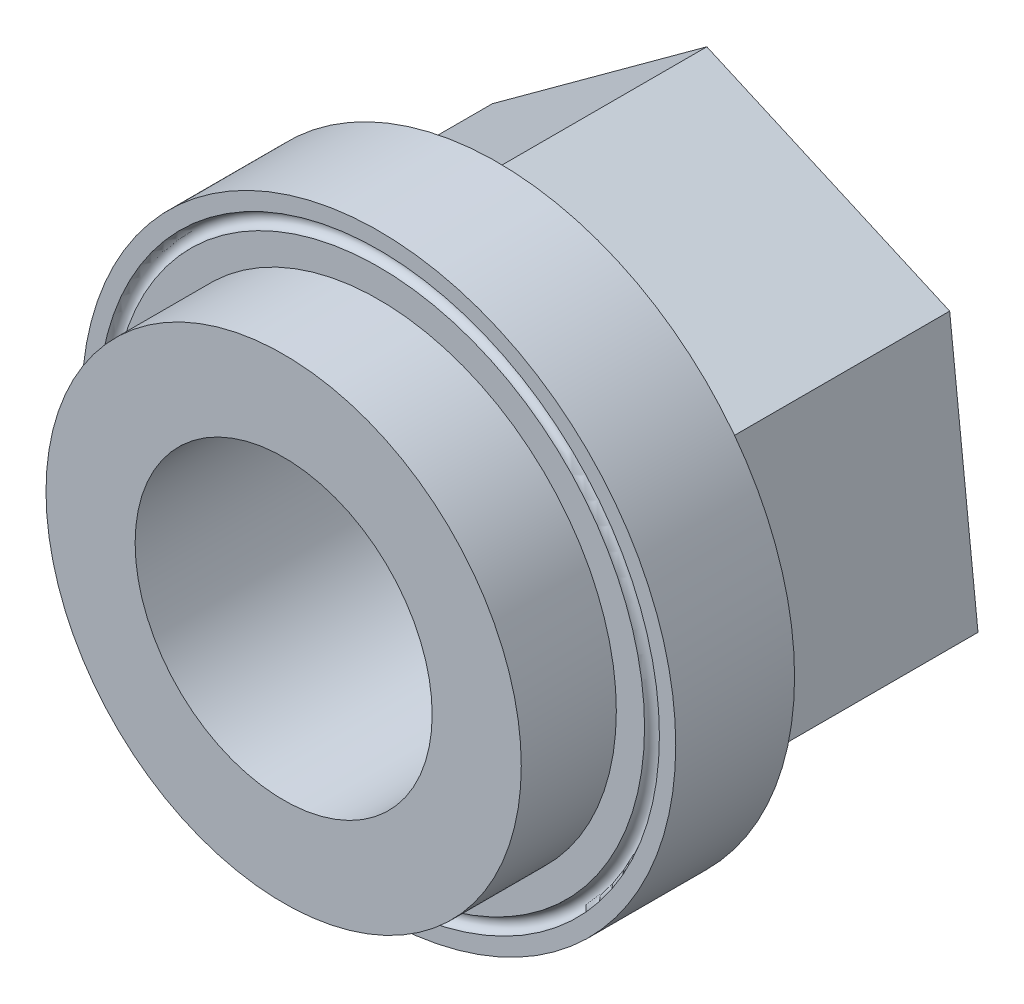
ISO-10303-21;
HEADER;
FILE_DESCRIPTION(('STEP AP214'),'2;1');
FILE_NAME('part.step','',(''),(''),'','','');
FILE_SCHEMA(('AUTOMOTIVE_DESIGN { 1 0 10303 214 1 1 1 1 }'));
ENDSEC;
DATA;
#1=APPLICATION_CONTEXT('core data for automotive mechanical design processes');
#2=APPLICATION_PROTOCOL_DEFINITION('international standard','automotive_design',2000,#1);
#3=PRODUCT_CONTEXT('',#1,'mechanical');
#4=PRODUCT('Part','Part','',(#3));
#5=PRODUCT_RELATED_PRODUCT_CATEGORY('part','',(#4));
#6=PRODUCT_DEFINITION_FORMATION('','',#4);
#7=PRODUCT_DEFINITION_CONTEXT('part definition',#1,'design');
#8=PRODUCT_DEFINITION('design','',#6,#7);
#9=PRODUCT_DEFINITION_SHAPE('','',#8);
#10=(LENGTH_UNIT() NAMED_UNIT(*) SI_UNIT(.MILLI.,.METRE.));
#11=(NAMED_UNIT(*) PLANE_ANGLE_UNIT() SI_UNIT($,.RADIAN.));
#12=(NAMED_UNIT(*) SI_UNIT($,.STERADIAN.) SOLID_ANGLE_UNIT());
#13=UNCERTAINTY_MEASURE_WITH_UNIT(LENGTH_MEASURE(1.E-05),#10,'distance_accuracy_value','');
#14=(GEOMETRIC_REPRESENTATION_CONTEXT(3) GLOBAL_UNCERTAINTY_ASSIGNED_CONTEXT((#13)) GLOBAL_UNIT_ASSIGNED_CONTEXT((#10,
#11,#12)) REPRESENTATION_CONTEXT('',''));
#15=CARTESIAN_POINT('',(0.,0.,0.));
#16=DIRECTION('',(0.,0.,1.));
#17=DIRECTION('',(1.,0.,0.));
#18=AXIS2_PLACEMENT_3D('',#15,#16,#17);
#19=CARTESIAN_POINT('',(0.,0.,10.));
#20=DIRECTION('',(0.,0.,1.));
#21=DIRECTION('',(1.,0.,0.));
#22=AXIS2_PLACEMENT_3D('',#19,#20,#21);
#23=PLANE('',#22);
#24=CARTESIAN_POINT('',(0.,0.,10.));
#25=DIRECTION('',(0.,0.,1.));
#26=DIRECTION('',(1.,0.,0.));
#27=AXIS2_PLACEMENT_3D('',#24,#25,#26);
#28=CIRCLE('',#27,25.);
#29=CARTESIAN_POINT('',(25.,0.,10.));
#30=VERTEX_POINT('',#29);
#31=EDGE_CURVE('E146',#30,#30,#28,.T.);
#32=ORIENTED_EDGE('',*,*,#31,.T.);
#33=EDGE_LOOP('',(#32));
#34=FACE_BOUND('',#33,.T.);
#35=CARTESIAN_POINT('',(0.,0.,10.));
#36=DIRECTION('',(0.,0.,1.));
#37=DIRECTION('',(1.,0.,0.));
#38=AXIS2_PLACEMENT_3D('',#35,#36,#37);
#39=CIRCLE('',#38,23.625);
#40=CARTESIAN_POINT('',(23.625,0.,10.));
#41=VERTEX_POINT('',#40);
#42=EDGE_CURVE('E12',#41,#41,#39,.T.);
#43=ORIENTED_EDGE('',*,*,#42,.F.);
#44=EDGE_LOOP('',(#43));
#45=FACE_BOUND('',#44,.T.);
#46=ADVANCED_FACE('F55',(#34,#45),#23,.T.);
#47=CARTESIAN_POINT('',(0.,0.,10.));
#48=DIRECTION('',(0.,0.,1.));
#49=DIRECTION('',(1.,0.,0.));
#50=AXIS2_PLACEMENT_3D('',#47,#48,#49);
#51=CIRCLE('',#50,20.);
#52=CARTESIAN_POINT('',(20.,0.,10.));
#53=VERTEX_POINT('',#52);
#54=EDGE_CURVE('E143',#53,#53,#51,.T.);
#55=ORIENTED_EDGE('',*,*,#54,.F.);
#56=EDGE_LOOP('',(#55));
#57=FACE_BOUND('',#56,.T.);
#58=CARTESIAN_POINT('',(0.,0.,10.));
#59=DIRECTION('',(0.,0.,-1.));
#60=DIRECTION('',(-1.,0.,0.));
#61=AXIS2_PLACEMENT_3D('',#58,#59,#60);
#62=CIRCLE('',#61,22.375);
#63=CARTESIAN_POINT('',(22.375,0.,10.));
#64=VERTEX_POINT('',#63);
#65=EDGE_CURVE('E63',#64,#64,#62,.T.);
#66=ORIENTED_EDGE('',*,*,#65,.F.);
#67=EDGE_LOOP('',(#66));
#68=FACE_BOUND('',#67,.T.);
#69=ADVANCED_FACE('F153',(#57,#68),#23,.T.);
#70=CARTESIAN_POINT('',(0.,0.,0.));
#71=DIRECTION('',(0.,0.,1.));
#72=DIRECTION('',(1.,0.,0.));
#73=AXIS2_PLACEMENT_3D('',#70,#71,#72);
#74=PLANE('',#73);
#75=CARTESIAN_POINT('',(0.,0.,0.));
#76=DIRECTION('',(0.,0.,1.));
#77=DIRECTION('',(1.,0.,0.));
#78=AXIS2_PLACEMENT_3D('',#75,#76,#77);
#79=CIRCLE('',#78,25.);
#80=CARTESIAN_POINT('',(25.,0.,0.));
#81=VERTEX_POINT('',#80);
#82=EDGE_CURVE('E137',#81,#81,#79,.T.);
#83=ORIENTED_EDGE('',*,*,#82,.F.);
#84=EDGE_LOOP('',(#83));
#85=FACE_BOUND('',#84,.T.);
#86=DIRECTION('',(0.106649643438628,-0.994296662749309,0.));
#87=VECTOR('',#86,1.);
#88=CARTESIAN_POINT('',(18.0534867210994,13.175555316386,0.));
#89=LINE('',#88,#87);
#90=CARTESIAN_POINT('',(18.0534867210994,13.175555316386,0.));
#91=VERTEX_POINT('',#90);
#92=CARTESIAN_POINT('',(20.4371089735071,-9.04700046916413,0.));
#93=VERTEX_POINT('',#92);
#94=EDGE_CURVE('E133',#91,#93,#89,.T.);
#95=ORIENTED_EDGE('',*,*,#94,.F.);
#96=DIRECTION('',(0.914410990558305,-0.40478703085225,0.));
#97=VECTOR('',#96,1.);
#98=CARTESIAN_POINT('',(-2.38362225240768,22.2225557855501,0.));
#99=LINE('',#98,#97);
#100=CARTESIAN_POINT('',(-2.38362225240768,22.2225557855501,0.));
#101=VERTEX_POINT('',#100);
#102=EDGE_CURVE('E130',#101,#91,#99,.T.);
#103=ORIENTED_EDGE('',*,*,#102,.F.);
#104=DIRECTION('',(0.807761347119676,0.589509631897059,0.));
#105=VECTOR('',#104,1.);
#106=CARTESIAN_POINT('',(-20.4371089735071,9.04700046916413,0.));
#107=LINE('',#106,#105);
#108=CARTESIAN_POINT('',(-20.4371089735071,9.04700046916413,0.));
#109=VERTEX_POINT('',#108);
#110=EDGE_CURVE('E331',#109,#101,#107,.T.);
#111=ORIENTED_EDGE('',*,*,#110,.F.);
#112=DIRECTION('',(-0.106649643438628,0.994296662749309,0.));
#113=VECTOR('',#112,1.);
#114=CARTESIAN_POINT('',(-18.0534867210994,-13.175555316386,0.));
#115=LINE('',#114,#113);
#116=CARTESIAN_POINT('',(-18.0534867210994,-13.175555316386,0.));
#117=VERTEX_POINT('',#116);
#118=EDGE_CURVE('E346',#117,#109,#115,.T.);
#119=ORIENTED_EDGE('',*,*,#118,.F.);
#120=DIRECTION('',(-0.914410990558305,0.40478703085225,0.));
#121=VECTOR('',#120,1.);
#122=CARTESIAN_POINT('',(2.38362225240767,-22.2225557855501,0.));
#123=LINE('',#122,#121);
#124=CARTESIAN_POINT('',(2.38362225240767,-22.2225557855501,0.));
#125=VERTEX_POINT('',#124);
#126=EDGE_CURVE('E349',#125,#117,#123,.T.);
#127=ORIENTED_EDGE('',*,*,#126,.F.);
#128=DIRECTION('',(-0.807761347119676,-0.589509631897059,0.));
#129=VECTOR('',#128,1.);
#130=CARTESIAN_POINT('',(20.4371089735071,-9.04700046916413,0.));
#131=LINE('',#130,#129);
#132=EDGE_CURVE('E324',#93,#125,#131,.T.);
#133=ORIENTED_EDGE('',*,*,#132,.F.);
#134=EDGE_LOOP('',(#95,#103,#111,#119,#127,#133));
#135=FACE_BOUND('',#134,.T.);
#136=ADVANCED_FACE('F155',(#85,#135),#74,.F.);
#137=CARTESIAN_POINT('',(0.,0.,10.));
#138=DIRECTION('',(0.,0.,-1.));
#139=DIRECTION('',(-1.,0.,0.));
#140=AXIS2_PLACEMENT_3D('',#137,#138,#139);
#141=CYLINDRICAL_SURFACE('',#140,25.);
#142=ORIENTED_EDGE('',*,*,#31,.F.);
#143=EDGE_LOOP('',(#142));
#144=FACE_BOUND('',#143,.T.);
#145=ORIENTED_EDGE('',*,*,#82,.T.);
#146=EDGE_LOOP('',(#145));
#147=FACE_BOUND('',#146,.T.);
#148=ADVANCED_FACE('F57',(#144,#147),#141,.T.);
#149=CARTESIAN_POINT('',(0.,0.,18.));
#150=DIRECTION('',(0.,0.,-1.));
#151=DIRECTION('',(-1.,0.,0.));
#152=AXIS2_PLACEMENT_3D('',#149,#150,#151);
#153=CYLINDRICAL_SURFACE('',#152,20.);
#154=CARTESIAN_POINT('',(0.,0.,18.));
#155=DIRECTION('',(0.,0.,1.));
#156=DIRECTION('',(1.,0.,0.));
#157=AXIS2_PLACEMENT_3D('',#154,#155,#156);
#158=CIRCLE('',#157,20.);
#159=CARTESIAN_POINT('',(20.,0.,18.));
#160=VERTEX_POINT('',#159);
#161=EDGE_CURVE('E134',#160,#160,#158,.T.);
#162=ORIENTED_EDGE('',*,*,#161,.F.);
#163=EDGE_LOOP('',(#162));
#164=FACE_BOUND('',#163,.T.);
#165=ORIENTED_EDGE('',*,*,#54,.T.);
#166=EDGE_LOOP('',(#165));
#167=FACE_BOUND('',#166,.T.);
#168=ADVANCED_FACE('F166',(#164,#167),#153,.T.);
#169=CARTESIAN_POINT('',(0.,0.,18.));
#170=DIRECTION('',(0.,0.,1.));
#171=DIRECTION('',(1.,0.,0.));
#172=AXIS2_PLACEMENT_3D('',#169,#170,#171);
#173=PLANE('',#172);
#174=CARTESIAN_POINT('',(0.,0.,18.));
#175=DIRECTION('',(0.,0.,-1.));
#176=DIRECTION('',(-1.,0.,0.));
#177=AXIS2_PLACEMENT_3D('',#174,#175,#176);
#178=CIRCLE('',#177,12.5);
#179=CARTESIAN_POINT('',(-12.5,0.,18.));
#180=VERTEX_POINT('',#179);
#181=EDGE_CURVE('E325',#180,#180,#178,.T.);
#182=ORIENTED_EDGE('',*,*,#181,.T.);
#183=EDGE_LOOP('',(#182));
#184=FACE_BOUND('',#183,.T.);
#185=ORIENTED_EDGE('',*,*,#161,.T.);
#186=EDGE_LOOP('',(#185));
#187=FACE_BOUND('',#186,.T.);
#188=ADVANCED_FACE('F169',(#184,#187),#173,.T.);
#189=CARTESIAN_POINT('',(18.0534867210994,13.175555316386,-20.));
#190=DIRECTION('',(-0.994296662749309,-0.106649643438628,0.));
#191=DIRECTION('',(0.106649643438628,-0.994296662749309,0.));
#192=AXIS2_PLACEMENT_3D('',#189,#190,#191);
#193=PLANE('',#192);
#194=ORIENTED_EDGE('',*,*,#94,.T.);
#195=DIRECTION('',(0.,0.,1.));
#196=VECTOR('',#195,1.);
#197=CARTESIAN_POINT('',(20.4371089735071,-9.04700046916413,-20.));
#198=LINE('',#197,#196);
#199=CARTESIAN_POINT('',(20.4371089735071,-9.04700046916413,-20.));
#200=VERTEX_POINT('',#199);
#201=EDGE_CURVE('E114',#200,#93,#198,.T.);
#202=ORIENTED_EDGE('',*,*,#201,.F.);
#203=DIRECTION('',(0.106649643438628,-0.994296662749309,0.));
#204=VECTOR('',#203,1.);
#205=CARTESIAN_POINT('',(18.0534867210994,13.175555316386,-20.));
#206=LINE('',#205,#204);
#207=CARTESIAN_POINT('',(18.0534867210994,13.175555316386,-20.));
#208=VERTEX_POINT('',#207);
#209=EDGE_CURVE('E121',#208,#200,#206,.T.);
#210=ORIENTED_EDGE('',*,*,#209,.F.);
#211=DIRECTION('',(0.,0.,1.));
#212=VECTOR('',#211,1.);
#213=CARTESIAN_POINT('',(18.0534867210994,13.175555316386,-20.));
#214=LINE('',#213,#212);
#215=EDGE_CURVE('E328',#208,#91,#214,.T.);
#216=ORIENTED_EDGE('',*,*,#215,.T.);
#217=EDGE_LOOP('',(#194,#202,#210,#216));
#218=FACE_BOUND('',#217,.T.);
#219=ADVANCED_FACE('F132',(#218),#193,.F.);
#220=CARTESIAN_POINT('',(20.4371089735071,-9.04700046916413,-20.));
#221=DIRECTION('',(-0.589509631897059,0.807761347119676,0.));
#222=DIRECTION('',(-0.807761347119676,-0.589509631897059,0.));
#223=AXIS2_PLACEMENT_3D('',#220,#221,#222);
#224=PLANE('',#223);
#225=ORIENTED_EDGE('',*,*,#132,.T.);
#226=DIRECTION('',(0.,0.,1.));
#227=VECTOR('',#226,1.);
#228=CARTESIAN_POINT('',(2.38362225240767,-22.2225557855501,-20.));
#229=LINE('',#228,#227);
#230=CARTESIAN_POINT('',(2.38362225240767,-22.2225557855501,-20.));
#231=VERTEX_POINT('',#230);
#232=EDGE_CURVE('E117',#231,#125,#229,.T.);
#233=ORIENTED_EDGE('',*,*,#232,.F.);
#234=DIRECTION('',(-0.807761347119676,-0.589509631897059,0.));
#235=VECTOR('',#234,1.);
#236=CARTESIAN_POINT('',(20.4371089735071,-9.04700046916413,-20.));
#237=LINE('',#236,#235);
#238=EDGE_CURVE('E109',#200,#231,#237,.T.);
#239=ORIENTED_EDGE('',*,*,#238,.F.);
#240=ORIENTED_EDGE('',*,*,#201,.T.);
#241=EDGE_LOOP('',(#225,#233,#239,#240));
#242=FACE_BOUND('',#241,.T.);
#243=ADVANCED_FACE('F112',(#242),#224,.F.);
#244=CARTESIAN_POINT('',(2.38362225240767,-22.2225557855501,-20.));
#245=DIRECTION('',(0.40478703085225,0.914410990558305,0.));
#246=DIRECTION('',(-0.914410990558305,0.40478703085225,0.));
#247=AXIS2_PLACEMENT_3D('',#244,#245,#246);
#248=PLANE('',#247);
#249=ORIENTED_EDGE('',*,*,#126,.T.);
#250=DIRECTION('',(0.,0.,1.));
#251=VECTOR('',#250,1.);
#252=CARTESIAN_POINT('',(-18.0534867210994,-13.175555316386,-20.));
#253=LINE('',#252,#251);
#254=CARTESIAN_POINT('',(-18.0534867210994,-13.175555316386,-20.));
#255=VERTEX_POINT('',#254);
#256=EDGE_CURVE('E139',#255,#117,#253,.T.);
#257=ORIENTED_EDGE('',*,*,#256,.F.);
#258=DIRECTION('',(-0.914410990558305,0.40478703085225,0.));
#259=VECTOR('',#258,1.);
#260=CARTESIAN_POINT('',(2.38362225240767,-22.2225557855501,-20.));
#261=LINE('',#260,#259);
#262=EDGE_CURVE('E120',#231,#255,#261,.T.);
#263=ORIENTED_EDGE('',*,*,#262,.F.);
#264=ORIENTED_EDGE('',*,*,#232,.T.);
#265=EDGE_LOOP('',(#249,#257,#263,#264));
#266=FACE_BOUND('',#265,.T.);
#267=ADVANCED_FACE('F178',(#266),#248,.F.);
#268=CARTESIAN_POINT('',(-18.0534867210994,-13.175555316386,-20.));
#269=DIRECTION('',(0.994296662749309,0.106649643438628,0.));
#270=DIRECTION('',(-0.106649643438628,0.994296662749309,0.));
#271=AXIS2_PLACEMENT_3D('',#268,#269,#270);
#272=PLANE('',#271);
#273=ORIENTED_EDGE('',*,*,#118,.T.);
#274=DIRECTION('',(0.,0.,1.));
#275=VECTOR('',#274,1.);
#276=CARTESIAN_POINT('',(-20.4371089735071,9.04700046916413,-20.));
#277=LINE('',#276,#275);
#278=CARTESIAN_POINT('',(-20.4371089735071,9.04700046916413,-20.));
#279=VERTEX_POINT('',#278);
#280=EDGE_CURVE('E334',#279,#109,#277,.T.);
#281=ORIENTED_EDGE('',*,*,#280,.F.);
#282=DIRECTION('',(-0.106649643438628,0.994296662749309,0.));
#283=VECTOR('',#282,1.);
#284=CARTESIAN_POINT('',(-18.0534867210994,-13.175555316386,-20.));
#285=LINE('',#284,#283);
#286=EDGE_CURVE('E347',#255,#279,#285,.T.);
#287=ORIENTED_EDGE('',*,*,#286,.F.);
#288=ORIENTED_EDGE('',*,*,#256,.T.);
#289=EDGE_LOOP('',(#273,#281,#287,#288));
#290=FACE_BOUND('',#289,.T.);
#291=ADVANCED_FACE('F181',(#290),#272,.F.);
#292=CARTESIAN_POINT('',(-20.4371089735071,9.04700046916413,-20.));
#293=DIRECTION('',(0.589509631897059,-0.807761347119676,0.));
#294=DIRECTION('',(0.807761347119676,0.589509631897059,0.));
#295=AXIS2_PLACEMENT_3D('',#292,#293,#294);
#296=PLANE('',#295);
#297=ORIENTED_EDGE('',*,*,#110,.T.);
#298=DIRECTION('',(0.,0.,1.));
#299=VECTOR('',#298,1.);
#300=CARTESIAN_POINT('',(-2.38362225240768,22.2225557855501,-20.));
#301=LINE('',#300,#299);
#302=CARTESIAN_POINT('',(-2.38362225240768,22.2225557855501,-20.));
#303=VERTEX_POINT('',#302);
#304=EDGE_CURVE('E330',#303,#101,#301,.T.);
#305=ORIENTED_EDGE('',*,*,#304,.F.);
#306=DIRECTION('',(0.807761347119676,0.589509631897059,0.));
#307=VECTOR('',#306,1.);
#308=CARTESIAN_POINT('',(-20.4371089735071,9.04700046916413,-20.));
#309=LINE('',#308,#307);
#310=EDGE_CURVE('E336',#279,#303,#309,.T.);
#311=ORIENTED_EDGE('',*,*,#310,.F.);
#312=ORIENTED_EDGE('',*,*,#280,.T.);
#313=EDGE_LOOP('',(#297,#305,#311,#312));
#314=FACE_BOUND('',#313,.T.);
#315=ADVANCED_FACE('F185',(#314),#296,.F.);
#316=CARTESIAN_POINT('',(-2.38362225240768,22.2225557855501,-20.));
#317=DIRECTION('',(-0.40478703085225,-0.914410990558305,0.));
#318=DIRECTION('',(0.914410990558305,-0.40478703085225,0.));
#319=AXIS2_PLACEMENT_3D('',#316,#317,#318);
#320=PLANE('',#319);
#321=ORIENTED_EDGE('',*,*,#102,.T.);
#322=ORIENTED_EDGE('',*,*,#215,.F.);
#323=DIRECTION('',(0.914410990558305,-0.40478703085225,0.));
#324=VECTOR('',#323,1.);
#325=CARTESIAN_POINT('',(-2.38362225240768,22.2225557855501,-20.));
#326=LINE('',#325,#324);
#327=EDGE_CURVE('E126',#303,#208,#326,.T.);
#328=ORIENTED_EDGE('',*,*,#327,.F.);
#329=ORIENTED_EDGE('',*,*,#304,.T.);
#330=EDGE_LOOP('',(#321,#322,#328,#329));
#331=FACE_BOUND('',#330,.T.);
#332=ADVANCED_FACE('F189',(#331),#320,.F.);
#333=CARTESIAN_POINT('',(0.,0.,-20.));
#334=DIRECTION('',(0.,0.,-1.));
#335=DIRECTION('',(-1.,0.,0.));
#336=AXIS2_PLACEMENT_3D('',#333,#334,#335);
#337=PLANE('',#336);
#338=CARTESIAN_POINT('',(0.,0.,-20.));
#339=DIRECTION('',(0.,0.,-1.));
#340=DIRECTION('',(-1.,0.,0.));
#341=AXIS2_PLACEMENT_3D('',#338,#339,#340);
#342=CIRCLE('',#341,12.5);
#343=CARTESIAN_POINT('',(-12.5,0.,-20.));
#344=VERTEX_POINT('',#343);
#345=EDGE_CURVE('E358',#344,#344,#342,.T.);
#346=ORIENTED_EDGE('',*,*,#345,.F.);
#347=EDGE_LOOP('',(#346));
#348=FACE_BOUND('',#347,.T.);
#349=ORIENTED_EDGE('',*,*,#209,.T.);
#350=ORIENTED_EDGE('',*,*,#238,.T.);
#351=ORIENTED_EDGE('',*,*,#262,.T.);
#352=ORIENTED_EDGE('',*,*,#286,.T.);
#353=ORIENTED_EDGE('',*,*,#310,.T.);
#354=ORIENTED_EDGE('',*,*,#327,.T.);
#355=EDGE_LOOP('',(#349,#350,#351,#352,#353,#354));
#356=FACE_BOUND('',#355,.T.);
#357=ADVANCED_FACE('F124',(#348,#356),#337,.T.);
#358=CARTESIAN_POINT('',(0.,0.,18.));
#359=DIRECTION('',(0.,0.,-1.));
#360=DIRECTION('',(-1.,0.,0.));
#361=AXIS2_PLACEMENT_3D('',#358,#359,#360);
#362=CYLINDRICAL_SURFACE('',#361,12.5);
#363=ORIENTED_EDGE('',*,*,#181,.F.);
#364=EDGE_LOOP('',(#363));
#365=FACE_BOUND('',#364,.T.);
#366=ORIENTED_EDGE('',*,*,#345,.T.);
#367=EDGE_LOOP('',(#366));
#368=FACE_BOUND('',#367,.T.);
#369=ADVANCED_FACE('F196',(#365,#368),#362,.F.);
#370=CARTESIAN_POINT('',(0.,0.,10.));
#371=DIRECTION('',(0.,0.,1.));
#372=DIRECTION('',(1.,0.,0.));
#373=AXIS2_PLACEMENT_3D('',#370,#371,#372);
#374=TOROIDAL_SURFACE('',#373,23.,0.625000000000001);
#375=ORIENTED_EDGE('',*,*,#42,.T.);
#376=CARTESIAN_POINT('',(23.,0.,10.));
#377=DIRECTION('',(0.,1.,0.));
#378=DIRECTION('',(-1.,0.,0.));
#379=AXIS2_PLACEMENT_3D('',#376,#377,#378);
#380=CIRCLE('',#379,0.625000000000001);
#381=EDGE_CURVE('E69',#41,#64,#380,.T.);
#382=ORIENTED_EDGE('',*,*,#381,.T.);
#383=ORIENTED_EDGE('',*,*,#65,.T.);
#384=ORIENTED_EDGE('',*,*,#381,.F.);
#385=EDGE_LOOP('',(#375,#382,#383,#384));
#386=FACE_BOUND('',#385,.T.);
#387=ADVANCED_FACE('F151',(#386),#374,.F.);
#388=CLOSED_SHELL('',(#46,#69,#136,#148,#168,#188,#219,#243,#267,#291,#315,#332,#357,#369,#387));
#389=MANIFOLD_SOLID_BREP('B2',#388);
#390=ADVANCED_BREP_SHAPE_REPRESENTATION('',(#18,#389),#14);
#391=SHAPE_DEFINITION_REPRESENTATION(#9,#390);
ENDSEC;
END-ISO-10303-21;
